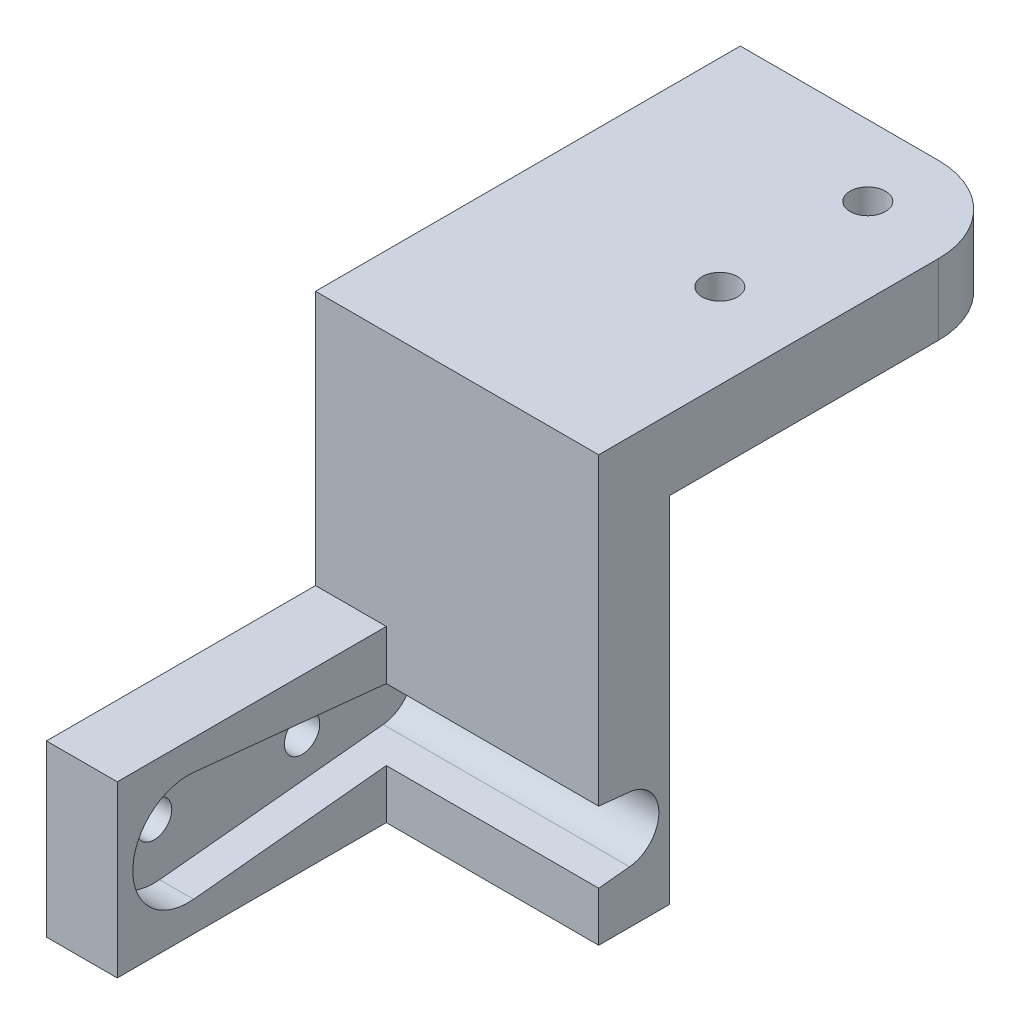
ISO-10303-21;
HEADER;
FILE_DESCRIPTION(('STEP AP214'),'2;1');
FILE_NAME('part.step','',(''),(''),'','','');
FILE_SCHEMA(('AUTOMOTIVE_DESIGN { 1 0 10303 214 1 1 1 1 }'));
ENDSEC;
DATA;
#1=APPLICATION_CONTEXT('core data for automotive mechanical design processes');
#2=APPLICATION_PROTOCOL_DEFINITION('international standard','automotive_design',2000,#1);
#3=PRODUCT_CONTEXT('',#1,'mechanical');
#4=PRODUCT('Part','Part','',(#3));
#5=PRODUCT_RELATED_PRODUCT_CATEGORY('part','',(#4));
#6=PRODUCT_DEFINITION_FORMATION('','',#4);
#7=PRODUCT_DEFINITION_CONTEXT('part definition',#1,'design');
#8=PRODUCT_DEFINITION('design','',#6,#7);
#9=PRODUCT_DEFINITION_SHAPE('','',#8);
#10=(LENGTH_UNIT() NAMED_UNIT(*) SI_UNIT(.MILLI.,.METRE.));
#11=(NAMED_UNIT(*) PLANE_ANGLE_UNIT() SI_UNIT($,.RADIAN.));
#12=(NAMED_UNIT(*) SI_UNIT($,.STERADIAN.) SOLID_ANGLE_UNIT());
#13=UNCERTAINTY_MEASURE_WITH_UNIT(LENGTH_MEASURE(1.E-05),#10,'distance_accuracy_value','');
#14=(GEOMETRIC_REPRESENTATION_CONTEXT(3) GLOBAL_UNCERTAINTY_ASSIGNED_CONTEXT((#13)) GLOBAL_UNIT_ASSIGNED_CONTEXT((#10,
#11,#12)) REPRESENTATION_CONTEXT('',''));
#15=CARTESIAN_POINT('',(0.,0.,0.));
#16=DIRECTION('',(0.,0.,1.));
#17=DIRECTION('',(1.,0.,0.));
#18=AXIS2_PLACEMENT_3D('',#15,#16,#17);
#19=CARTESIAN_POINT('',(10.,5.,-15.));
#20=DIRECTION('',(-1.,0.,0.));
#21=DIRECTION('',(0.,0.,1.));
#22=AXIS2_PLACEMENT_3D('',#19,#20,#21);
#23=PLANE('',#22);
#24=DIRECTION('',(0.,0.,-1.));
#25=VECTOR('',#24,1.);
#26=CARTESIAN_POINT('',(10.,0.,-15.));
#27=LINE('',#26,#25);
#28=CARTESIAN_POINT('',(10.,0.,10.));
#29=VERTEX_POINT('',#28);
#30=CARTESIAN_POINT('',(10.,0.,-8.99999999999999));
#31=VERTEX_POINT('',#30);
#32=EDGE_CURVE('E359',#29,#31,#27,.T.);
#33=ORIENTED_EDGE('',*,*,#32,.T.);
#34=DIRECTION('',(0.,-1.,0.));
#35=VECTOR('',#34,1.);
#36=CARTESIAN_POINT('',(10.,5.,-8.99999999999999));
#37=LINE('',#36,#35);
#38=CARTESIAN_POINT('',(10.,5.,-8.99999999999999));
#39=VERTEX_POINT('',#38);
#40=EDGE_CURVE('E56',#31,#39,#37,.F.);
#41=ORIENTED_EDGE('',*,*,#40,.T.);
#42=DIRECTION('',(0.,0.,-1.));
#43=VECTOR('',#42,1.);
#44=CARTESIAN_POINT('',(10.,5.,-15.));
#45=LINE('',#44,#43);
#46=CARTESIAN_POINT('',(10.,5.,15.));
#47=VERTEX_POINT('',#46);
#48=EDGE_CURVE('E369',#47,#39,#45,.T.);
#49=ORIENTED_EDGE('',*,*,#48,.F.);
#50=DIRECTION('',(0.,-1.,0.));
#51=VECTOR('',#50,1.);
#52=CARTESIAN_POINT('',(10.,5.,15.));
#53=LINE('',#52,#51);
#54=CARTESIAN_POINT('',(10.,-16.4917367371962,15.));
#55=VERTEX_POINT('',#54);
#56=EDGE_CURVE('E391',#47,#55,#53,.T.);
#57=ORIENTED_EDGE('',*,*,#56,.T.);
#58=DIRECTION('',(0.,0.100313479623824,0.994955881336334));
#59=VECTOR('',#58,1.);
#60=CARTESIAN_POINT('',(10.,-15.1196720627883,28.6087774294671));
#61=LINE('',#60,#59);
#62=CARTESIAN_POINT('',(10.,-16.7116014729264,12.8192789968652));
#63=VERTEX_POINT('',#62);
#64=EDGE_CURVE('E234',#63,#55,#61,.T.);
#65=ORIENTED_EDGE('',*,*,#64,.F.);
#66=CARTESIAN_POINT('',(10.,-19.,13.05));
#67=DIRECTION('',(1.,0.,0.));
#68=DIRECTION('',(0.,0.,-1.));
#69=AXIS2_PLACEMENT_3D('',#66,#67,#68);
#70=CIRCLE('',#69,2.3);
#71=CARTESIAN_POINT('',(10.,-21.2883985270736,12.8192789968652));
#72=VERTEX_POINT('',#71);
#73=EDGE_CURVE('E231',#72,#63,#70,.T.);
#74=ORIENTED_EDGE('',*,*,#73,.F.);
#75=DIRECTION('',(0.,0.100313479623824,-0.994955881336334));
#76=VECTOR('',#75,1.);
#77=CARTESIAN_POINT('',(10.,-22.8803279372117,28.6087774294671));
#78=LINE('',#77,#76);
#79=CARTESIAN_POINT('',(10.,-21.5082632628038,15.));
#80=VERTEX_POINT('',#79);
#81=EDGE_CURVE('E228',#80,#72,#78,.T.);
#82=ORIENTED_EDGE('',*,*,#81,.F.);
#83=CARTESIAN_POINT('',(10.,-25.,15.));
#84=VERTEX_POINT('',#83);
#85=EDGE_CURVE('E382',#80,#84,#53,.T.);
#86=ORIENTED_EDGE('',*,*,#85,.T.);
#87=DIRECTION('',(0.,0.,-1.));
#88=VECTOR('',#87,1.);
#89=CARTESIAN_POINT('',(10.,-25.,15.));
#90=LINE('',#89,#88);
#91=CARTESIAN_POINT('',(10.,-25.,10.));
#92=VERTEX_POINT('',#91);
#93=EDGE_CURVE('E272',#84,#92,#90,.T.);
#94=ORIENTED_EDGE('',*,*,#93,.T.);
#95=DIRECTION('',(0.,1.,0.));
#96=VECTOR('',#95,1.);
#97=CARTESIAN_POINT('',(10.,0.,10.));
#98=LINE('',#97,#96);
#99=EDGE_CURVE('E275',#92,#29,#98,.T.);
#100=ORIENTED_EDGE('',*,*,#99,.T.);
#101=EDGE_LOOP('',(#33,#41,#49,#57,#65,#74,#82,#86,#94,#100));
#102=FACE_BOUND('',#101,.T.);
#103=ADVANCED_FACE('F47',(#102),#23,.F.);
#104=CARTESIAN_POINT('',(-10.,5.,15.));
#105=DIRECTION('',(0.,0.,-1.));
#106=DIRECTION('',(-1.,0.,0.));
#107=AXIS2_PLACEMENT_3D('',#104,#105,#106);
#108=PLANE('',#107);
#109=DIRECTION('',(1.,0.,0.));
#110=VECTOR('',#109,1.);
#111=CARTESIAN_POINT('',(-10.,-21.5082632628038,15.));
#112=LINE('',#111,#110);
#113=CARTESIAN_POINT('',(-5.,-21.5082632628038,15.));
#114=VERTEX_POINT('',#113);
#115=EDGE_CURVE('E247',#114,#80,#112,.T.);
#116=ORIENTED_EDGE('',*,*,#115,.F.);
#117=DIRECTION('',(0.,-1.,0.));
#118=VECTOR('',#117,1.);
#119=CARTESIAN_POINT('',(-5.,-25.,15.));
#120=LINE('',#119,#118);
#121=CARTESIAN_POINT('',(-5.,-25.,15.));
#122=VERTEX_POINT('',#121);
#123=EDGE_CURVE('E256',#114,#122,#120,.T.);
#124=ORIENTED_EDGE('',*,*,#123,.T.);
#125=DIRECTION('',(1.,0.,0.));
#126=VECTOR('',#125,1.);
#127=CARTESIAN_POINT('',(-32.4722050542442,-25.,15.));
#128=LINE('',#127,#126);
#129=EDGE_CURVE('E250',#122,#84,#128,.T.);
#130=ORIENTED_EDGE('',*,*,#129,.T.);
#131=ORIENTED_EDGE('',*,*,#85,.F.);
#132=EDGE_LOOP('',(#116,#124,#130,#131));
#133=FACE_BOUND('',#132,.T.);
#134=ADVANCED_FACE('F424',(#133),#108,.F.);
#135=DIRECTION('',(-1.,0.,0.));
#136=VECTOR('',#135,1.);
#137=CARTESIAN_POINT('',(-10.,-16.4917367371962,15.));
#138=LINE('',#137,#136);
#139=CARTESIAN_POINT('',(-5.,-16.4917367371962,15.));
#140=VERTEX_POINT('',#139);
#141=EDGE_CURVE('E197',#55,#140,#138,.T.);
#142=ORIENTED_EDGE('',*,*,#141,.F.);
#143=ORIENTED_EDGE('',*,*,#56,.F.);
#144=DIRECTION('',(1.,0.,0.));
#145=VECTOR('',#144,1.);
#146=CARTESIAN_POINT('',(-10.,5.,15.));
#147=LINE('',#146,#145);
#148=CARTESIAN_POINT('',(-10.,5.,15.));
#149=VERTEX_POINT('',#148);
#150=EDGE_CURVE('E379',#149,#47,#147,.T.);
#151=ORIENTED_EDGE('',*,*,#150,.F.);
#152=DIRECTION('',(0.,-1.,0.));
#153=VECTOR('',#152,1.);
#154=CARTESIAN_POINT('',(-10.,5.,15.));
#155=LINE('',#154,#153);
#156=CARTESIAN_POINT('',(-10.,-13.,15.));
#157=VERTEX_POINT('',#156);
#158=EDGE_CURVE('E395',#149,#157,#155,.T.);
#159=ORIENTED_EDGE('',*,*,#158,.T.);
#160=DIRECTION('',(-1.,0.,0.));
#161=VECTOR('',#160,1.);
#162=CARTESIAN_POINT('',(10.,-13.,15.));
#163=LINE('',#162,#161);
#164=CARTESIAN_POINT('',(-5.,-13.,15.));
#165=VERTEX_POINT('',#164);
#166=EDGE_CURVE('E305',#165,#157,#163,.T.);
#167=ORIENTED_EDGE('',*,*,#166,.F.);
#168=EDGE_CURVE('E251',#165,#140,#120,.T.);
#169=ORIENTED_EDGE('',*,*,#168,.T.);
#170=EDGE_LOOP('',(#142,#143,#151,#159,#167,#169));
#171=FACE_BOUND('',#170,.T.);
#172=ADVANCED_FACE('F447',(#171),#108,.F.);
#173=CARTESIAN_POINT('',(-5.,5.,-15.));
#174=DIRECTION('',(1.,0.,0.));
#175=DIRECTION('',(0.,0.,-1.));
#176=AXIS2_PLACEMENT_3D('',#173,#174,#175);
#177=PLANE('',#176);
#178=ORIENTED_EDGE('',*,*,#123,.F.);
#179=DIRECTION('',(0.,-0.100313479623824,0.994955881336334));
#180=VECTOR('',#179,1.);
#181=CARTESIAN_POINT('',(-5.,-18.2472914692723,-17.3438393026833));
#182=LINE('',#181,#180);
#183=CARTESIAN_POINT('',(-5.,-22.8803279372117,28.6087774294671));
#184=VERTEX_POINT('',#183);
#185=EDGE_CURVE('E409',#114,#184,#182,.T.);
#186=ORIENTED_EDGE('',*,*,#185,.T.);
#187=CARTESIAN_POINT('',(-5.,-19.,29.));
#188=DIRECTION('',(1.,0.,0.));
#189=DIRECTION('',(0.,0.,-1.));
#190=AXIS2_PLACEMENT_3D('',#187,#188,#189);
#191=CIRCLE('',#190,3.9);
#192=CARTESIAN_POINT('',(-5.,-15.1196720627883,28.6087774294671));
#193=VERTEX_POINT('',#192);
#194=EDGE_CURVE('E193',#184,#193,#191,.F.);
#195=ORIENTED_EDGE('',*,*,#194,.T.);
#196=DIRECTION('',(0.,-0.100313479623824,-0.994955881336334));
#197=VECTOR('',#196,1.);
#198=CARTESIAN_POINT('',(-5.,-19.2696944094042,-12.5530799492895));
#199=LINE('',#198,#197);
#200=EDGE_CURVE('E403',#193,#140,#199,.T.);
#201=ORIENTED_EDGE('',*,*,#200,.T.);
#202=ORIENTED_EDGE('',*,*,#168,.F.);
#203=DIRECTION('',(0.,0.,-1.));
#204=VECTOR('',#203,1.);
#205=CARTESIAN_POINT('',(-4.99999999999999,-13.,34.));
#206=LINE('',#205,#204);
#207=CARTESIAN_POINT('',(-4.99999999999999,-13.,34.));
#208=VERTEX_POINT('',#207);
#209=EDGE_CURVE('E255',#208,#165,#206,.T.);
#210=ORIENTED_EDGE('',*,*,#209,.F.);
#211=DIRECTION('',(0.,1.,0.));
#212=VECTOR('',#211,1.);
#213=CARTESIAN_POINT('',(-4.99999999999999,-25.,34.));
#214=LINE('',#213,#212);
#215=CARTESIAN_POINT('',(-5.,-25.,34.));
#216=VERTEX_POINT('',#215);
#217=EDGE_CURVE('E260',#216,#208,#214,.T.);
#218=ORIENTED_EDGE('',*,*,#217,.F.);
#219=DIRECTION('',(0.,0.,1.));
#220=VECTOR('',#219,1.);
#221=CARTESIAN_POINT('',(-4.99999999999999,-25.,34.));
#222=LINE('',#221,#220);
#223=EDGE_CURVE('E264',#122,#216,#222,.T.);
#224=ORIENTED_EDGE('',*,*,#223,.F.);
#225=EDGE_LOOP('',(#178,#186,#195,#201,#202,#210,#218,#224));
#226=FACE_BOUND('',#225,.T.);
#227=ADVANCED_FACE('F429',(#226),#177,.T.);
#228=CARTESIAN_POINT('',(10.,-13.,15.));
#229=DIRECTION('',(0.,-1.,0.));
#230=DIRECTION('',(0.,0.,-1.));
#231=AXIS2_PLACEMENT_3D('',#228,#229,#230);
#232=PLANE('',#231);
#233=ORIENTED_EDGE('',*,*,#209,.T.);
#234=ORIENTED_EDGE('',*,*,#166,.T.);
#235=DIRECTION('',(0.,0.,1.));
#236=VECTOR('',#235,1.);
#237=CARTESIAN_POINT('',(-10.,-13.,15.));
#238=LINE('',#237,#236);
#239=CARTESIAN_POINT('',(-10.,-13.,34.));
#240=VERTEX_POINT('',#239);
#241=EDGE_CURVE('E271',#157,#240,#238,.T.);
#242=ORIENTED_EDGE('',*,*,#241,.T.);
#243=DIRECTION('',(-1.,0.,0.));
#244=VECTOR('',#243,1.);
#245=CARTESIAN_POINT('',(10.,-13.,34.));
#246=LINE('',#245,#244);
#247=EDGE_CURVE('E302',#208,#240,#246,.T.);
#248=ORIENTED_EDGE('',*,*,#247,.F.);
#249=EDGE_LOOP('',(#233,#234,#242,#248));
#250=FACE_BOUND('',#249,.T.);
#251=ADVANCED_FACE('F453',(#250),#232,.F.);
#252=CARTESIAN_POINT('',(10.,-13.,34.));
#253=DIRECTION('',(0.,0.,-1.));
#254=DIRECTION('',(-1.,0.,0.));
#255=AXIS2_PLACEMENT_3D('',#252,#253,#254);
#256=PLANE('',#255);
#257=ORIENTED_EDGE('',*,*,#217,.T.);
#258=ORIENTED_EDGE('',*,*,#247,.T.);
#259=DIRECTION('',(0.,-1.,0.));
#260=VECTOR('',#259,1.);
#261=CARTESIAN_POINT('',(-10.,-13.,34.));
#262=LINE('',#261,#260);
#263=CARTESIAN_POINT('',(-10.,-25.,34.));
#264=VERTEX_POINT('',#263);
#265=EDGE_CURVE('E283',#240,#264,#262,.T.);
#266=ORIENTED_EDGE('',*,*,#265,.T.);
#267=DIRECTION('',(-1.,0.,0.));
#268=VECTOR('',#267,1.);
#269=CARTESIAN_POINT('',(10.,-25.,34.));
#270=LINE('',#269,#268);
#271=EDGE_CURVE('E299',#216,#264,#270,.T.);
#272=ORIENTED_EDGE('',*,*,#271,.F.);
#273=EDGE_LOOP('',(#257,#258,#266,#272));
#274=FACE_BOUND('',#273,.T.);
#275=ADVANCED_FACE('F457',(#274),#256,.F.);
#276=CARTESIAN_POINT('',(-10.,5.,-15.));
#277=DIRECTION('',(0.,0.,1.));
#278=DIRECTION('',(1.,0.,0.));
#279=AXIS2_PLACEMENT_3D('',#276,#277,#278);
#280=PLANE('',#279);
#281=DIRECTION('',(-1.,0.,0.));
#282=VECTOR('',#281,1.);
#283=CARTESIAN_POINT('',(-10.,5.,-15.));
#284=LINE('',#283,#282);
#285=CARTESIAN_POINT('',(4.,5.,-15.));
#286=VERTEX_POINT('',#285);
#287=CARTESIAN_POINT('',(-10.,5.,-15.));
#288=VERTEX_POINT('',#287);
#289=EDGE_CURVE('E372',#286,#288,#284,.T.);
#290=ORIENTED_EDGE('',*,*,#289,.F.);
#291=DIRECTION('',(0.,-1.,0.));
#292=VECTOR('',#291,1.);
#293=CARTESIAN_POINT('',(4.,5.,-15.));
#294=LINE('',#293,#292);
#295=CARTESIAN_POINT('',(4.,0.,-15.));
#296=VERTEX_POINT('',#295);
#297=EDGE_CURVE('E412',#286,#296,#294,.T.);
#298=ORIENTED_EDGE('',*,*,#297,.T.);
#299=DIRECTION('',(-1.,0.,0.));
#300=VECTOR('',#299,1.);
#301=CARTESIAN_POINT('',(-10.,0.,-15.));
#302=LINE('',#301,#300);
#303=CARTESIAN_POINT('',(-10.,0.,-15.));
#304=VERTEX_POINT('',#303);
#305=EDGE_CURVE('E385',#296,#304,#302,.T.);
#306=ORIENTED_EDGE('',*,*,#305,.T.);
#307=DIRECTION('',(0.,-1.,0.));
#308=VECTOR('',#307,1.);
#309=CARTESIAN_POINT('',(-10.,5.,-15.));
#310=LINE('',#309,#308);
#311=EDGE_CURVE('E399',#288,#304,#310,.T.);
#312=ORIENTED_EDGE('',*,*,#311,.F.);
#313=EDGE_LOOP('',(#290,#298,#306,#312));
#314=FACE_BOUND('',#313,.T.);
#315=ADVANCED_FACE('F474',(#314),#280,.F.);
#316=CARTESIAN_POINT('',(-10.,5.,-15.));
#317=DIRECTION('',(1.,0.,0.));
#318=DIRECTION('',(0.,0.,-1.));
#319=AXIS2_PLACEMENT_3D('',#316,#317,#318);
#320=PLANE('',#319);
#321=CARTESIAN_POINT('',(-10.,-19.,29.));
#322=DIRECTION('',(1.,0.,0.));
#323=DIRECTION('',(0.,0.,-1.));
#324=AXIS2_PLACEMENT_3D('',#321,#322,#323);
#325=CIRCLE('',#324,1.25);
#326=CARTESIAN_POINT('',(-10.,-19.,27.75));
#327=VERTEX_POINT('',#326);
#328=EDGE_CURVE('E214',#327,#327,#325,.T.);
#329=ORIENTED_EDGE('',*,*,#328,.T.);
#330=EDGE_LOOP('',(#329));
#331=FACE_BOUND('',#330,.T.);
#332=CARTESIAN_POINT('',(-10.,-19.,18.55));
#333=DIRECTION('',(1.,0.,0.));
#334=DIRECTION('',(0.,0.,-1.));
#335=AXIS2_PLACEMENT_3D('',#332,#333,#334);
#336=CIRCLE('',#335,1.25);
#337=CARTESIAN_POINT('',(-10.,-19.,17.3));
#338=VERTEX_POINT('',#337);
#339=EDGE_CURVE('E221',#338,#338,#336,.T.);
#340=ORIENTED_EDGE('',*,*,#339,.T.);
#341=EDGE_LOOP('',(#340));
#342=FACE_BOUND('',#341,.T.);
#343=DIRECTION('',(0.,0.,1.));
#344=VECTOR('',#343,1.);
#345=CARTESIAN_POINT('',(-10.,0.,-15.));
#346=LINE('',#345,#344);
#347=CARTESIAN_POINT('',(-10.,0.,10.));
#348=VERTEX_POINT('',#347);
#349=EDGE_CURVE('E373',#304,#348,#346,.T.);
#350=ORIENTED_EDGE('',*,*,#349,.T.);
#351=DIRECTION('',(0.,1.,0.));
#352=VECTOR('',#351,1.);
#353=CARTESIAN_POINT('',(-10.,0.,10.));
#354=LINE('',#353,#352);
#355=CARTESIAN_POINT('',(-10.,-25.,10.));
#356=VERTEX_POINT('',#355);
#357=EDGE_CURVE('E276',#356,#348,#354,.T.);
#358=ORIENTED_EDGE('',*,*,#357,.F.);
#359=DIRECTION('',(0.,0.,-1.));
#360=VECTOR('',#359,1.);
#361=CARTESIAN_POINT('',(-10.,-25.,15.));
#362=LINE('',#361,#360);
#363=EDGE_CURVE('E287',#264,#356,#362,.T.);
#364=ORIENTED_EDGE('',*,*,#363,.F.);
#365=ORIENTED_EDGE('',*,*,#265,.F.);
#366=ORIENTED_EDGE('',*,*,#241,.F.);
#367=ORIENTED_EDGE('',*,*,#158,.F.);
#368=DIRECTION('',(0.,0.,1.));
#369=VECTOR('',#368,1.);
#370=CARTESIAN_POINT('',(-10.,5.,-15.));
#371=LINE('',#370,#369);
#372=EDGE_CURVE('E376',#288,#149,#371,.T.);
#373=ORIENTED_EDGE('',*,*,#372,.F.);
#374=ORIENTED_EDGE('',*,*,#311,.T.);
#375=EDGE_LOOP('',(#350,#358,#364,#365,#366,#367,#373,#374));
#376=FACE_BOUND('',#375,.T.);
#377=ADVANCED_FACE('F461',(#331,#342,#376),#320,.F.);
#378=CARTESIAN_POINT('',(0.,5.,0.));
#379=DIRECTION('',(0.,1.,0.));
#380=DIRECTION('',(0.,0.,1.));
#381=AXIS2_PLACEMENT_3D('',#378,#379,#380);
#382=PLANE('',#381);
#383=CARTESIAN_POINT('',(4.,5.,-9.99999999999999));
#384=DIRECTION('',(0.,-1.,0.));
#385=DIRECTION('',(0.,0.,-1.));
#386=AXIS2_PLACEMENT_3D('',#383,#384,#385);
#387=CIRCLE('',#386,1.25);
#388=CARTESIAN_POINT('',(4.,5.,-11.25));
#389=VERTEX_POINT('',#388);
#390=EDGE_CURVE('E309',#389,#389,#387,.T.);
#391=ORIENTED_EDGE('',*,*,#390,.T.);
#392=EDGE_LOOP('',(#391));
#393=FACE_BOUND('',#392,.T.);
#394=CARTESIAN_POINT('',(4.,5.,0.450000000000004));
#395=DIRECTION('',(0.,-1.,0.));
#396=DIRECTION('',(0.,0.,-1.));
#397=AXIS2_PLACEMENT_3D('',#394,#395,#396);
#398=CIRCLE('',#397,1.25);
#399=CARTESIAN_POINT('',(4.,5.,-0.799999999999996));
#400=VERTEX_POINT('',#399);
#401=EDGE_CURVE('E308',#400,#400,#398,.T.);
#402=ORIENTED_EDGE('',*,*,#401,.T.);
#403=EDGE_LOOP('',(#402));
#404=FACE_BOUND('',#403,.T.);
#405=ORIENTED_EDGE('',*,*,#48,.T.);
#406=CARTESIAN_POINT('',(4.,5.,-8.99999999999999));
#407=DIRECTION('',(0.,1.,0.));
#408=DIRECTION('',(0.,0.,1.));
#409=AXIS2_PLACEMENT_3D('',#406,#407,#408);
#410=CIRCLE('',#409,6.);
#411=EDGE_CURVE('E12',#39,#286,#410,.T.);
#412=ORIENTED_EDGE('',*,*,#411,.T.);
#413=ORIENTED_EDGE('',*,*,#289,.T.);
#414=ORIENTED_EDGE('',*,*,#372,.T.);
#415=ORIENTED_EDGE('',*,*,#150,.T.);
#416=EDGE_LOOP('',(#405,#412,#413,#414,#415));
#417=FACE_BOUND('',#416,.T.);
#418=ADVANCED_FACE('F471',(#393,#404,#417),#382,.T.);
#419=CARTESIAN_POINT('',(0.,0.,0.));
#420=DIRECTION('',(0.,1.,0.));
#421=DIRECTION('',(0.,0.,1.));
#422=AXIS2_PLACEMENT_3D('',#419,#420,#421);
#423=PLANE('',#422);
#424=DIRECTION('',(-0.100313479623824,0.,0.994955881336334));
#425=VECTOR('',#424,1.);
#426=CARTESIAN_POINT('',(7.8803279372117,0.,-9.60877742946708));
#427=LINE('',#426,#425);
#428=CARTESIAN_POINT('',(7.8803279372117,0.,-9.60877742946708));
#429=VERTEX_POINT('',#428);
#430=CARTESIAN_POINT('',(6.28839852707357,0.,6.1807210031348));
#431=VERTEX_POINT('',#430);
#432=EDGE_CURVE('E345',#429,#431,#427,.T.);
#433=ORIENTED_EDGE('',*,*,#432,.F.);
#434=CARTESIAN_POINT('',(4.,0.,-9.99999999999999));
#435=DIRECTION('',(0.,-1.,0.));
#436=DIRECTION('',(0.,0.,-1.));
#437=AXIS2_PLACEMENT_3D('',#434,#435,#436);
#438=CIRCLE('',#437,3.9);
#439=CARTESIAN_POINT('',(0.1196720627883,0.,-9.60877742946708));
#440=VERTEX_POINT('',#439);
#441=EDGE_CURVE('E313',#440,#429,#438,.T.);
#442=ORIENTED_EDGE('',*,*,#441,.F.);
#443=DIRECTION('',(-0.100313479623824,0.,-0.994955881336334));
#444=VECTOR('',#443,1.);
#445=CARTESIAN_POINT('',(0.1196720627883,0.,-9.60877742946708));
#446=LINE('',#445,#444);
#447=CARTESIAN_POINT('',(1.71160147292643,0.,6.1807210031348));
#448=VERTEX_POINT('',#447);
#449=EDGE_CURVE('E330',#448,#440,#446,.T.);
#450=ORIENTED_EDGE('',*,*,#449,.F.);
#451=CARTESIAN_POINT('',(4.,0.,5.95));
#452=DIRECTION('',(0.,-1.,0.));
#453=DIRECTION('',(0.,0.,-1.));
#454=AXIS2_PLACEMENT_3D('',#451,#452,#453);
#455=CIRCLE('',#454,2.3);
#456=EDGE_CURVE('E349',#431,#448,#455,.T.);
#457=ORIENTED_EDGE('',*,*,#456,.F.);
#458=EDGE_LOOP('',(#433,#442,#450,#457));
#459=FACE_BOUND('',#458,.T.);
#460=ORIENTED_EDGE('',*,*,#305,.F.);
#461=CARTESIAN_POINT('',(4.,0.,-8.99999999999999));
#462=DIRECTION('',(0.,1.,0.));
#463=DIRECTION('',(0.,0.,1.));
#464=AXIS2_PLACEMENT_3D('',#461,#462,#463);
#465=CIRCLE('',#464,6.);
#466=EDGE_CURVE('E70',#296,#31,#465,.F.);
#467=ORIENTED_EDGE('',*,*,#466,.T.);
#468=ORIENTED_EDGE('',*,*,#32,.F.);
#469=DIRECTION('',(-1.,0.,0.));
#470=VECTOR('',#469,1.);
#471=CARTESIAN_POINT('',(10.,0.,10.));
#472=LINE('',#471,#470);
#473=EDGE_CURVE('E279',#29,#348,#472,.T.);
#474=ORIENTED_EDGE('',*,*,#473,.T.);
#475=ORIENTED_EDGE('',*,*,#349,.F.);
#476=EDGE_LOOP('',(#460,#467,#468,#474,#475));
#477=FACE_BOUND('',#476,.T.);
#478=ADVANCED_FACE('F465',(#459,#477),#423,.F.);
#479=CARTESIAN_POINT('',(4.,2.4,-9.99999999999999));
#480=DIRECTION('',(0.,-1.,0.));
#481=DIRECTION('',(0.,0.,-1.));
#482=AXIS2_PLACEMENT_3D('',#479,#480,#481);
#483=CYLINDRICAL_SURFACE('',#482,3.9);
#484=ORIENTED_EDGE('',*,*,#441,.T.);
#485=DIRECTION('',(0.,-1.,0.));
#486=VECTOR('',#485,1.);
#487=CARTESIAN_POINT('',(7.8803279372117,2.4,-9.60877742946708));
#488=LINE('',#487,#486);
#489=CARTESIAN_POINT('',(7.8803279372117,2.4,-9.60877742946708));
#490=VERTEX_POINT('',#489);
#491=EDGE_CURVE('E342',#490,#429,#488,.T.);
#492=ORIENTED_EDGE('',*,*,#491,.F.);
#493=CARTESIAN_POINT('',(4.,2.4,-9.99999999999999));
#494=DIRECTION('',(0.,-1.,0.));
#495=DIRECTION('',(0.,0.,-1.));
#496=AXIS2_PLACEMENT_3D('',#493,#494,#495);
#497=CIRCLE('',#496,3.9);
#498=CARTESIAN_POINT('',(0.1196720627883,2.4,-9.60877742946708));
#499=VERTEX_POINT('',#498);
#500=EDGE_CURVE('E325',#499,#490,#497,.T.);
#501=ORIENTED_EDGE('',*,*,#500,.F.);
#502=DIRECTION('',(0.,-1.,0.));
#503=VECTOR('',#502,1.);
#504=CARTESIAN_POINT('',(0.1196720627883,2.4,-9.60877742946708));
#505=LINE('',#504,#503);
#506=EDGE_CURVE('E356',#499,#440,#505,.T.);
#507=ORIENTED_EDGE('',*,*,#506,.T.);
#508=EDGE_LOOP('',(#484,#492,#501,#507));
#509=FACE_BOUND('',#508,.T.);
#510=ADVANCED_FACE('F499',(#509),#483,.F.);
#511=CARTESIAN_POINT('',(0.1196720627883,2.4,-9.60877742946708));
#512=DIRECTION('',(-0.994955881336334,0.,0.100313479623824));
#513=DIRECTION('',(0.100313479623824,0.,0.994955881336334));
#514=AXIS2_PLACEMENT_3D('',#511,#512,#513);
#515=PLANE('',#514);
#516=ORIENTED_EDGE('',*,*,#449,.T.);
#517=ORIENTED_EDGE('',*,*,#506,.F.);
#518=DIRECTION('',(-0.100313479623824,0.,-0.994955881336334));
#519=VECTOR('',#518,1.);
#520=CARTESIAN_POINT('',(0.1196720627883,2.4,-9.60877742946708));
#521=LINE('',#520,#519);
#522=CARTESIAN_POINT('',(1.71160147292643,2.4,6.1807210031348));
#523=VERTEX_POINT('',#522);
#524=EDGE_CURVE('E338',#523,#499,#521,.T.);
#525=ORIENTED_EDGE('',*,*,#524,.F.);
#526=DIRECTION('',(0.,-1.,0.));
#527=VECTOR('',#526,1.);
#528=CARTESIAN_POINT('',(1.71160147292643,2.4,6.1807210031348));
#529=LINE('',#528,#527);
#530=EDGE_CURVE('E360',#523,#448,#529,.T.);
#531=ORIENTED_EDGE('',*,*,#530,.T.);
#532=EDGE_LOOP('',(#516,#517,#525,#531));
#533=FACE_BOUND('',#532,.T.);
#534=ADVANCED_FACE('F505',(#533),#515,.F.);
#535=CARTESIAN_POINT('',(4.,2.4,5.95));
#536=DIRECTION('',(0.,-1.,0.));
#537=DIRECTION('',(0.,0.,-1.));
#538=AXIS2_PLACEMENT_3D('',#535,#536,#537);
#539=CYLINDRICAL_SURFACE('',#538,2.3);
#540=ORIENTED_EDGE('',*,*,#456,.T.);
#541=ORIENTED_EDGE('',*,*,#530,.F.);
#542=CARTESIAN_POINT('',(4.,2.4,5.95));
#543=DIRECTION('',(0.,-1.,0.));
#544=DIRECTION('',(0.,0.,-1.));
#545=AXIS2_PLACEMENT_3D('',#542,#543,#544);
#546=CIRCLE('',#545,2.3);
#547=CARTESIAN_POINT('',(6.28839852707357,2.4,6.1807210031348));
#548=VERTEX_POINT('',#547);
#549=EDGE_CURVE('E334',#548,#523,#546,.T.);
#550=ORIENTED_EDGE('',*,*,#549,.F.);
#551=DIRECTION('',(0.,-1.,0.));
#552=VECTOR('',#551,1.);
#553=CARTESIAN_POINT('',(6.28839852707357,2.4,6.1807210031348));
#554=LINE('',#553,#552);
#555=EDGE_CURVE('E363',#548,#431,#554,.T.);
#556=ORIENTED_EDGE('',*,*,#555,.T.);
#557=EDGE_LOOP('',(#540,#541,#550,#556));
#558=FACE_BOUND('',#557,.T.);
#559=ADVANCED_FACE('F511',(#558),#539,.F.);
#560=CARTESIAN_POINT('',(7.8803279372117,2.4,-9.60877742946708));
#561=DIRECTION('',(0.994955881336334,0.,0.100313479623824));
#562=DIRECTION('',(0.100313479623824,0.,-0.994955881336334));
#563=AXIS2_PLACEMENT_3D('',#560,#561,#562);
#564=PLANE('',#563);
#565=ORIENTED_EDGE('',*,*,#432,.T.);
#566=ORIENTED_EDGE('',*,*,#555,.F.);
#567=DIRECTION('',(-0.100313479623824,0.,0.994955881336334));
#568=VECTOR('',#567,1.);
#569=CARTESIAN_POINT('',(7.8803279372117,2.4,-9.60877742946708));
#570=LINE('',#569,#568);
#571=EDGE_CURVE('E329',#490,#548,#570,.T.);
#572=ORIENTED_EDGE('',*,*,#571,.F.);
#573=ORIENTED_EDGE('',*,*,#491,.T.);
#574=EDGE_LOOP('',(#565,#566,#572,#573));
#575=FACE_BOUND('',#574,.T.);
#576=ADVANCED_FACE('F507',(#575),#564,.F.);
#577=CARTESIAN_POINT('',(4.,2.4,-9.99999999999999));
#578=DIRECTION('',(0.,-1.,0.));
#579=DIRECTION('',(0.,0.,-1.));
#580=AXIS2_PLACEMENT_3D('',#577,#578,#579);
#581=PLANE('',#580);
#582=CARTESIAN_POINT('',(4.,2.4,-9.99999999999999));
#583=DIRECTION('',(0.,-1.,0.));
#584=DIRECTION('',(0.,0.,-1.));
#585=AXIS2_PLACEMENT_3D('',#582,#583,#584);
#586=CIRCLE('',#585,1.25);
#587=CARTESIAN_POINT('',(4.,2.4,-11.25));
#588=VERTEX_POINT('',#587);
#589=EDGE_CURVE('E314',#588,#588,#586,.T.);
#590=ORIENTED_EDGE('',*,*,#589,.F.);
#591=EDGE_LOOP('',(#590));
#592=FACE_BOUND('',#591,.T.);
#593=CARTESIAN_POINT('',(4.,2.4,0.450000000000004));
#594=DIRECTION('',(0.,-1.,0.));
#595=DIRECTION('',(0.,0.,-1.));
#596=AXIS2_PLACEMENT_3D('',#593,#594,#595);
#597=CIRCLE('',#596,1.25);
#598=CARTESIAN_POINT('',(4.,2.4,-0.799999999999996));
#599=VERTEX_POINT('',#598);
#600=EDGE_CURVE('E318',#599,#599,#597,.T.);
#601=ORIENTED_EDGE('',*,*,#600,.F.);
#602=EDGE_LOOP('',(#601));
#603=FACE_BOUND('',#602,.T.);
#604=ORIENTED_EDGE('',*,*,#500,.T.);
#605=ORIENTED_EDGE('',*,*,#571,.T.);
#606=ORIENTED_EDGE('',*,*,#549,.T.);
#607=ORIENTED_EDGE('',*,*,#524,.T.);
#608=EDGE_LOOP('',(#604,#605,#606,#607));
#609=FACE_BOUND('',#608,.T.);
#610=ADVANCED_FACE('F510',(#592,#603,#609),#581,.T.);
#611=CARTESIAN_POINT('',(4.,5.,0.450000000000004));
#612=DIRECTION('',(0.,-1.,0.));
#613=DIRECTION('',(0.,0.,-1.));
#614=AXIS2_PLACEMENT_3D('',#611,#612,#613);
#615=CYLINDRICAL_SURFACE('',#614,1.25);
#616=ORIENTED_EDGE('',*,*,#401,.F.);
#617=EDGE_LOOP('',(#616));
#618=FACE_BOUND('',#617,.T.);
#619=ORIENTED_EDGE('',*,*,#600,.T.);
#620=EDGE_LOOP('',(#619));
#621=FACE_BOUND('',#620,.T.);
#622=ADVANCED_FACE('F521',(#618,#621),#615,.F.);
#623=CARTESIAN_POINT('',(4.,5.,-9.99999999999999));
#624=DIRECTION('',(0.,-1.,0.));
#625=DIRECTION('',(0.,0.,-1.));
#626=AXIS2_PLACEMENT_3D('',#623,#624,#625);
#627=CYLINDRICAL_SURFACE('',#626,1.25);
#628=ORIENTED_EDGE('',*,*,#390,.F.);
#629=EDGE_LOOP('',(#628));
#630=FACE_BOUND('',#629,.T.);
#631=ORIENTED_EDGE('',*,*,#589,.T.);
#632=EDGE_LOOP('',(#631));
#633=FACE_BOUND('',#632,.T.);
#634=ADVANCED_FACE('F525',(#630,#633),#627,.F.);
#635=CARTESIAN_POINT('',(10.,-25.,15.));
#636=DIRECTION('',(0.,1.,0.));
#637=DIRECTION('',(0.,0.,1.));
#638=AXIS2_PLACEMENT_3D('',#635,#636,#637);
#639=PLANE('',#638);
#640=ORIENTED_EDGE('',*,*,#93,.F.);
#641=ORIENTED_EDGE('',*,*,#129,.F.);
#642=ORIENTED_EDGE('',*,*,#223,.T.);
#643=ORIENTED_EDGE('',*,*,#271,.T.);
#644=ORIENTED_EDGE('',*,*,#363,.T.);
#645=DIRECTION('',(-1.,0.,0.));
#646=VECTOR('',#645,1.);
#647=CARTESIAN_POINT('',(10.,-25.,10.));
#648=LINE('',#647,#646);
#649=EDGE_CURVE('E295',#92,#356,#648,.T.);
#650=ORIENTED_EDGE('',*,*,#649,.F.);
#651=EDGE_LOOP('',(#640,#641,#642,#643,#644,#650));
#652=FACE_BOUND('',#651,.T.);
#653=ADVANCED_FACE('F432',(#652),#639,.F.);
#654=CARTESIAN_POINT('',(10.,0.,10.));
#655=DIRECTION('',(0.,0.,1.));
#656=DIRECTION('',(0.,-1.,0.));
#657=AXIS2_PLACEMENT_3D('',#654,#655,#656);
#658=PLANE('',#657);
#659=ORIENTED_EDGE('',*,*,#357,.T.);
#660=ORIENTED_EDGE('',*,*,#473,.F.);
#661=ORIENTED_EDGE('',*,*,#99,.F.);
#662=ORIENTED_EDGE('',*,*,#649,.T.);
#663=EDGE_LOOP('',(#659,#660,#661,#662));
#664=FACE_BOUND('',#663,.T.);
#665=ADVANCED_FACE('F464',(#664),#658,.F.);
#666=CARTESIAN_POINT('',(10.,-22.8803279372117,28.6087774294671));
#667=DIRECTION('',(0.,0.994955881336334,0.100313479623824));
#668=DIRECTION('',(0.,-0.100313479623824,0.994955881336334));
#669=AXIS2_PLACEMENT_3D('',#666,#667,#668);
#670=PLANE('',#669);
#671=ORIENTED_EDGE('',*,*,#115,.T.);
#672=ORIENTED_EDGE('',*,*,#81,.T.);
#673=DIRECTION('',(-1.,0.,0.));
#674=VECTOR('',#673,1.);
#675=CARTESIAN_POINT('',(10.,-21.2883985270736,12.8192789968652));
#676=LINE('',#675,#674);
#677=CARTESIAN_POINT('',(-7.4,-21.2883985270736,12.8192789968652));
#678=VERTEX_POINT('',#677);
#679=EDGE_CURVE('E198',#72,#678,#676,.T.);
#680=ORIENTED_EDGE('',*,*,#679,.T.);
#681=DIRECTION('',(0.,0.100313479623824,-0.994955881336334));
#682=VECTOR('',#681,1.);
#683=CARTESIAN_POINT('',(-7.4,-22.8803279372117,28.6087774294671));
#684=LINE('',#683,#682);
#685=CARTESIAN_POINT('',(-7.4,-22.8803279372117,28.6087774294671));
#686=VERTEX_POINT('',#685);
#687=EDGE_CURVE('E201',#686,#678,#684,.T.);
#688=ORIENTED_EDGE('',*,*,#687,.F.);
#689=DIRECTION('',(-1.,0.,0.));
#690=VECTOR('',#689,1.);
#691=CARTESIAN_POINT('',(10.,-22.8803279372117,28.6087774294671));
#692=LINE('',#691,#690);
#693=EDGE_CURVE('E185',#184,#686,#692,.T.);
#694=ORIENTED_EDGE('',*,*,#693,.F.);
#695=ORIENTED_EDGE('',*,*,#185,.F.);
#696=EDGE_LOOP('',(#671,#672,#680,#688,#694,#695));
#697=FACE_BOUND('',#696,.T.);
#698=ADVANCED_FACE('F202',(#697),#670,.T.);
#699=CARTESIAN_POINT('',(10.,-15.1196720627883,28.6087774294671));
#700=DIRECTION('',(0.,-0.994955881336334,0.100313479623824));
#701=DIRECTION('',(0.,-0.100313479623824,-0.994955881336334));
#702=AXIS2_PLACEMENT_3D('',#699,#700,#701);
#703=PLANE('',#702);
#704=ORIENTED_EDGE('',*,*,#141,.T.);
#705=ORIENTED_EDGE('',*,*,#200,.F.);
#706=DIRECTION('',(-1.,0.,0.));
#707=VECTOR('',#706,1.);
#708=CARTESIAN_POINT('',(10.,-15.1196720627883,28.6087774294671));
#709=LINE('',#708,#707);
#710=CARTESIAN_POINT('',(-7.4,-15.1196720627883,28.6087774294671));
#711=VERTEX_POINT('',#710);
#712=EDGE_CURVE('E237',#193,#711,#709,.T.);
#713=ORIENTED_EDGE('',*,*,#712,.T.);
#714=DIRECTION('',(0.,0.100313479623824,0.994955881336334));
#715=VECTOR('',#714,1.);
#716=CARTESIAN_POINT('',(-7.4,-15.1196720627883,28.6087774294671));
#717=LINE('',#716,#715);
#718=CARTESIAN_POINT('',(-7.4,-16.7116014729264,12.8192789968652));
#719=VERTEX_POINT('',#718);
#720=EDGE_CURVE('E212',#719,#711,#717,.T.);
#721=ORIENTED_EDGE('',*,*,#720,.F.);
#722=DIRECTION('',(-1.,0.,0.));
#723=VECTOR('',#722,1.);
#724=CARTESIAN_POINT('',(10.,-16.7116014729264,12.8192789968652));
#725=LINE('',#724,#723);
#726=EDGE_CURVE('E240',#63,#719,#725,.T.);
#727=ORIENTED_EDGE('',*,*,#726,.F.);
#728=ORIENTED_EDGE('',*,*,#64,.T.);
#729=EDGE_LOOP('',(#704,#705,#713,#721,#727,#728));
#730=FACE_BOUND('',#729,.T.);
#731=ADVANCED_FACE('F443',(#730),#703,.T.);
#732=CARTESIAN_POINT('',(10.,-19.,29.));
#733=DIRECTION('',(-1.,0.,0.));
#734=DIRECTION('',(0.,0.,1.));
#735=AXIS2_PLACEMENT_3D('',#732,#733,#734);
#736=CYLINDRICAL_SURFACE('',#735,3.9);
#737=ORIENTED_EDGE('',*,*,#693,.T.);
#738=CARTESIAN_POINT('',(-7.4,-19.,29.));
#739=DIRECTION('',(1.,0.,0.));
#740=DIRECTION('',(0.,0.,-1.));
#741=AXIS2_PLACEMENT_3D('',#738,#739,#740);
#742=CIRCLE('',#741,3.9);
#743=EDGE_CURVE('E190',#711,#686,#742,.T.);
#744=ORIENTED_EDGE('',*,*,#743,.F.);
#745=ORIENTED_EDGE('',*,*,#712,.F.);
#746=ORIENTED_EDGE('',*,*,#194,.F.);
#747=EDGE_LOOP('',(#737,#744,#745,#746));
#748=FACE_BOUND('',#747,.T.);
#749=ADVANCED_FACE('F187',(#748),#736,.F.);
#750=CARTESIAN_POINT('',(10.,-19.,13.05));
#751=DIRECTION('',(-1.,0.,0.));
#752=DIRECTION('',(0.,0.,1.));
#753=AXIS2_PLACEMENT_3D('',#750,#751,#752);
#754=CYLINDRICAL_SURFACE('',#753,2.3);
#755=ORIENTED_EDGE('',*,*,#679,.F.);
#756=ORIENTED_EDGE('',*,*,#73,.T.);
#757=ORIENTED_EDGE('',*,*,#726,.T.);
#758=CARTESIAN_POINT('',(-7.4,-19.,13.05));
#759=DIRECTION('',(1.,0.,0.));
#760=DIRECTION('',(0.,0.,-1.));
#761=AXIS2_PLACEMENT_3D('',#758,#759,#760);
#762=CIRCLE('',#761,2.3);
#763=EDGE_CURVE('E208',#678,#719,#762,.T.);
#764=ORIENTED_EDGE('',*,*,#763,.F.);
#765=EDGE_LOOP('',(#755,#756,#757,#764));
#766=FACE_BOUND('',#765,.T.);
#767=ADVANCED_FACE('F440',(#766),#754,.F.);
#768=CARTESIAN_POINT('',(-7.4,-19.,29.));
#769=DIRECTION('',(1.,0.,0.));
#770=DIRECTION('',(0.,0.,-1.));
#771=AXIS2_PLACEMENT_3D('',#768,#769,#770);
#772=PLANE('',#771);
#773=CARTESIAN_POINT('',(-7.4,-19.,29.));
#774=DIRECTION('',(1.,0.,0.));
#775=DIRECTION('',(0.,0.,-1.));
#776=AXIS2_PLACEMENT_3D('',#773,#774,#775);
#777=CIRCLE('',#776,1.25);
#778=CARTESIAN_POINT('',(-7.4,-19.,27.75));
#779=VERTEX_POINT('',#778);
#780=EDGE_CURVE('E218',#779,#779,#777,.T.);
#781=ORIENTED_EDGE('',*,*,#780,.F.);
#782=EDGE_LOOP('',(#781));
#783=FACE_BOUND('',#782,.T.);
#784=CARTESIAN_POINT('',(-7.4,-19.,18.55));
#785=DIRECTION('',(1.,0.,0.));
#786=DIRECTION('',(0.,0.,-1.));
#787=AXIS2_PLACEMENT_3D('',#784,#785,#786);
#788=CIRCLE('',#787,1.25);
#789=CARTESIAN_POINT('',(-7.4,-19.,17.3));
#790=VERTEX_POINT('',#789);
#791=EDGE_CURVE('E562',#790,#790,#788,.T.);
#792=ORIENTED_EDGE('',*,*,#791,.F.);
#793=EDGE_LOOP('',(#792));
#794=FACE_BOUND('',#793,.T.);
#795=ORIENTED_EDGE('',*,*,#743,.T.);
#796=ORIENTED_EDGE('',*,*,#687,.T.);
#797=ORIENTED_EDGE('',*,*,#763,.T.);
#798=ORIENTED_EDGE('',*,*,#720,.T.);
#799=EDGE_LOOP('',(#795,#796,#797,#798));
#800=FACE_BOUND('',#799,.T.);
#801=ADVANCED_FACE('F210',(#783,#794,#800),#772,.T.);
#802=CARTESIAN_POINT('',(-10.,-19.,18.55));
#803=DIRECTION('',(1.,0.,0.));
#804=DIRECTION('',(0.,0.,-1.));
#805=AXIS2_PLACEMENT_3D('',#802,#803,#804);
#806=CYLINDRICAL_SURFACE('',#805,1.25);
#807=ORIENTED_EDGE('',*,*,#339,.F.);
#808=EDGE_LOOP('',(#807));
#809=FACE_BOUND('',#808,.T.);
#810=ORIENTED_EDGE('',*,*,#791,.T.);
#811=EDGE_LOOP('',(#810));
#812=FACE_BOUND('',#811,.T.);
#813=ADVANCED_FACE('F547',(#809,#812),#806,.F.);
#814=CARTESIAN_POINT('',(-10.,-19.,29.));
#815=DIRECTION('',(1.,0.,0.));
#816=DIRECTION('',(0.,0.,-1.));
#817=AXIS2_PLACEMENT_3D('',#814,#815,#816);
#818=CYLINDRICAL_SURFACE('',#817,1.25);
#819=ORIENTED_EDGE('',*,*,#328,.F.);
#820=EDGE_LOOP('',(#819));
#821=FACE_BOUND('',#820,.T.);
#822=ORIENTED_EDGE('',*,*,#780,.T.);
#823=EDGE_LOOP('',(#822));
#824=FACE_BOUND('',#823,.T.);
#825=ADVANCED_FACE('F551',(#821,#824),#818,.F.);
#826=CARTESIAN_POINT('',(4.,5.,-8.99999999999999));
#827=DIRECTION('',(0.,-1.,0.));
#828=DIRECTION('',(0.,0.,-1.));
#829=AXIS2_PLACEMENT_3D('',#826,#827,#828);
#830=CYLINDRICAL_SURFACE('',#829,6.);
#831=ORIENTED_EDGE('',*,*,#411,.F.);
#832=ORIENTED_EDGE('',*,*,#40,.F.);
#833=ORIENTED_EDGE('',*,*,#466,.F.);
#834=ORIENTED_EDGE('',*,*,#297,.F.);
#835=EDGE_LOOP('',(#831,#832,#833,#834));
#836=FACE_BOUND('',#835,.T.);
#837=ADVANCED_FACE('F49',(#836),#830,.T.);
#838=CLOSED_SHELL('',(#103,#134,#172,#227,#251,#275,#315,#377,#418,#478,#510,#534,#559,#576,
#610,#622,#634,#653,#665,#698,#731,#749,#767,#801,#813,#825,#837));
#839=MANIFOLD_SOLID_BREP('B2',#838);
#840=ADVANCED_BREP_SHAPE_REPRESENTATION('',(#18,#839),#14);
#841=SHAPE_DEFINITION_REPRESENTATION(#9,#840);
ENDSEC;
END-ISO-10303-21;
